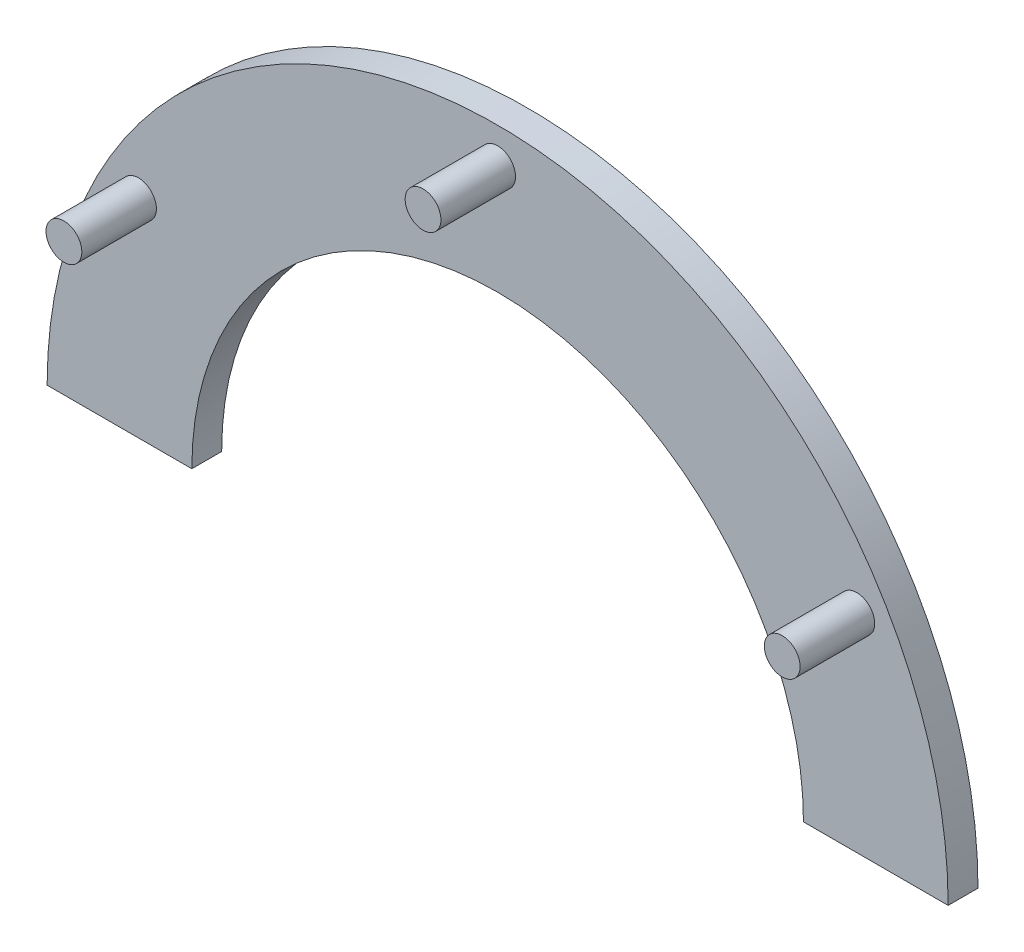
ISO-10303-21;
HEADER;
FILE_DESCRIPTION(('STEP AP214'),'2;1');
FILE_NAME('part.step','',(''),(''),'','','');
FILE_SCHEMA(('AUTOMOTIVE_DESIGN { 1 0 10303 214 1 1 1 1 }'));
ENDSEC;
DATA;
#1=APPLICATION_CONTEXT('core data for automotive mechanical design processes');
#2=APPLICATION_PROTOCOL_DEFINITION('international standard','automotive_design',2000,#1);
#3=PRODUCT_CONTEXT('',#1,'mechanical');
#4=PRODUCT('Part','Part','',(#3));
#5=PRODUCT_RELATED_PRODUCT_CATEGORY('part','',(#4));
#6=PRODUCT_DEFINITION_FORMATION('','',#4);
#7=PRODUCT_DEFINITION_CONTEXT('part definition',#1,'design');
#8=PRODUCT_DEFINITION('design','',#6,#7);
#9=PRODUCT_DEFINITION_SHAPE('','',#8);
#10=(LENGTH_UNIT() NAMED_UNIT(*) SI_UNIT(.MILLI.,.METRE.));
#11=(NAMED_UNIT(*) PLANE_ANGLE_UNIT() SI_UNIT($,.RADIAN.));
#12=(NAMED_UNIT(*) SI_UNIT($,.STERADIAN.) SOLID_ANGLE_UNIT());
#13=UNCERTAINTY_MEASURE_WITH_UNIT(LENGTH_MEASURE(1.E-05),#10,'distance_accuracy_value','');
#14=(GEOMETRIC_REPRESENTATION_CONTEXT(3) GLOBAL_UNCERTAINTY_ASSIGNED_CONTEXT((#13)) GLOBAL_UNIT_ASSIGNED_CONTEXT((#10,
#11,#12)) REPRESENTATION_CONTEXT('',''));
#15=CARTESIAN_POINT('',(0.,0.,0.));
#16=DIRECTION('',(0.,0.,1.));
#17=DIRECTION('',(1.,0.,0.));
#18=AXIS2_PLACEMENT_3D('',#15,#16,#17);
#19=CARTESIAN_POINT('',(0.,0.,2.));
#20=DIRECTION('',(0.,0.,-1.));
#21=DIRECTION('',(-1.,0.,0.));
#22=AXIS2_PLACEMENT_3D('',#19,#20,#21);
#23=CYLINDRICAL_SURFACE('',#22,20.5);
#24=CARTESIAN_POINT('',(0.,0.,0.));
#25=DIRECTION('',(0.,0.,-1.));
#26=DIRECTION('',(1.,0.,0.));
#27=AXIS2_PLACEMENT_3D('',#24,#25,#26);
#28=CIRCLE('',#27,20.5);
#29=CARTESIAN_POINT('',(-20.5,0.,0.));
#30=VERTEX_POINT('',#29);
#31=CARTESIAN_POINT('',(20.5,0.,0.));
#32=VERTEX_POINT('',#31);
#33=EDGE_CURVE('E100',#30,#32,#28,.T.);
#34=ORIENTED_EDGE('',*,*,#33,.T.);
#35=DIRECTION('',(0.,0.,-1.));
#36=VECTOR('',#35,1.);
#37=CARTESIAN_POINT('',(20.5,0.,2.));
#38=LINE('',#37,#36);
#39=CARTESIAN_POINT('',(20.5,0.,2.));
#40=VERTEX_POINT('',#39);
#41=EDGE_CURVE('E36',#40,#32,#38,.T.);
#42=ORIENTED_EDGE('',*,*,#41,.F.);
#43=CARTESIAN_POINT('',(0.,0.,2.));
#44=DIRECTION('',(0.,0.,-1.));
#45=DIRECTION('',(1.,0.,0.));
#46=AXIS2_PLACEMENT_3D('',#43,#44,#45);
#47=CIRCLE('',#46,20.5);
#48=CARTESIAN_POINT('',(-20.5,0.,2.));
#49=VERTEX_POINT('',#48);
#50=EDGE_CURVE('E87',#49,#40,#47,.T.);
#51=ORIENTED_EDGE('',*,*,#50,.F.);
#52=DIRECTION('',(0.,0.,-1.));
#53=VECTOR('',#52,1.);
#54=CARTESIAN_POINT('',(-20.5,0.,2.));
#55=LINE('',#54,#53);
#56=EDGE_CURVE('E96',#49,#30,#55,.T.);
#57=ORIENTED_EDGE('',*,*,#56,.T.);
#58=EDGE_LOOP('',(#34,#42,#51,#57));
#59=FACE_BOUND('',#58,.T.);
#60=ADVANCED_FACE('F33',(#59),#23,.F.);
#61=CARTESIAN_POINT('',(30.2,0.,2.));
#62=DIRECTION('',(0.,1.,0.));
#63=DIRECTION('',(-1.,0.,0.));
#64=AXIS2_PLACEMENT_3D('',#61,#62,#63);
#65=PLANE('',#64);
#66=DIRECTION('',(1.,0.,0.));
#67=VECTOR('',#66,1.);
#68=CARTESIAN_POINT('',(30.2,0.,0.));
#69=LINE('',#68,#67);
#70=CARTESIAN_POINT('',(30.2,0.,0.));
#71=VERTEX_POINT('',#70);
#72=EDGE_CURVE('E92',#32,#71,#69,.T.);
#73=ORIENTED_EDGE('',*,*,#72,.T.);
#74=DIRECTION('',(0.,0.,-1.));
#75=VECTOR('',#74,1.);
#76=CARTESIAN_POINT('',(30.2,0.,2.));
#77=LINE('',#76,#75);
#78=CARTESIAN_POINT('',(30.2,0.,2.));
#79=VERTEX_POINT('',#78);
#80=EDGE_CURVE('E90',#79,#71,#77,.T.);
#81=ORIENTED_EDGE('',*,*,#80,.F.);
#82=DIRECTION('',(1.,0.,0.));
#83=VECTOR('',#82,1.);
#84=CARTESIAN_POINT('',(30.2,0.,2.));
#85=LINE('',#84,#83);
#86=EDGE_CURVE('E82',#40,#79,#85,.T.);
#87=ORIENTED_EDGE('',*,*,#86,.F.);
#88=ORIENTED_EDGE('',*,*,#41,.T.);
#89=EDGE_LOOP('',(#73,#81,#87,#88));
#90=FACE_BOUND('',#89,.T.);
#91=ADVANCED_FACE('F91',(#90),#65,.F.);
#92=CARTESIAN_POINT('',(0.,0.,2.));
#93=DIRECTION('',(0.,0.,-1.));
#94=DIRECTION('',(-1.,0.,0.));
#95=AXIS2_PLACEMENT_3D('',#92,#93,#94);
#96=CYLINDRICAL_SURFACE('',#95,30.2);
#97=CARTESIAN_POINT('',(0.,0.,0.));
#98=DIRECTION('',(0.,0.,1.));
#99=DIRECTION('',(1.,0.,0.));
#100=AXIS2_PLACEMENT_3D('',#97,#98,#99);
#101=CIRCLE('',#100,30.2);
#102=CARTESIAN_POINT('',(-30.2,0.,0.));
#103=VERTEX_POINT('',#102);
#104=EDGE_CURVE('E68',#71,#103,#101,.T.);
#105=ORIENTED_EDGE('',*,*,#104,.T.);
#106=DIRECTION('',(0.,0.,-1.));
#107=VECTOR('',#106,1.);
#108=CARTESIAN_POINT('',(-30.2,0.,2.));
#109=LINE('',#108,#107);
#110=CARTESIAN_POINT('',(-30.2,0.,2.));
#111=VERTEX_POINT('',#110);
#112=EDGE_CURVE('E93',#111,#103,#109,.T.);
#113=ORIENTED_EDGE('',*,*,#112,.F.);
#114=CARTESIAN_POINT('',(0.,0.,2.));
#115=DIRECTION('',(0.,0.,1.));
#116=DIRECTION('',(1.,0.,0.));
#117=AXIS2_PLACEMENT_3D('',#114,#115,#116);
#118=CIRCLE('',#117,30.2);
#119=EDGE_CURVE('E85',#79,#111,#118,.T.);
#120=ORIENTED_EDGE('',*,*,#119,.F.);
#121=ORIENTED_EDGE('',*,*,#80,.T.);
#122=EDGE_LOOP('',(#105,#113,#120,#121));
#123=FACE_BOUND('',#122,.T.);
#124=ADVANCED_FACE('F94',(#123),#96,.T.);
#125=CARTESIAN_POINT('',(-20.5,0.,2.));
#126=DIRECTION('',(0.,1.,0.));
#127=DIRECTION('',(0.,0.,1.));
#128=AXIS2_PLACEMENT_3D('',#125,#126,#127);
#129=PLANE('',#128);
#130=DIRECTION('',(1.,0.,0.));
#131=VECTOR('',#130,1.);
#132=CARTESIAN_POINT('',(-20.5,0.,0.));
#133=LINE('',#132,#131);
#134=EDGE_CURVE('E74',#103,#30,#133,.T.);
#135=ORIENTED_EDGE('',*,*,#134,.T.);
#136=ORIENTED_EDGE('',*,*,#56,.F.);
#137=DIRECTION('',(1.,0.,0.));
#138=VECTOR('',#137,1.);
#139=CARTESIAN_POINT('',(-20.5,0.,2.));
#140=LINE('',#139,#138);
#141=EDGE_CURVE('E51',#111,#49,#140,.T.);
#142=ORIENTED_EDGE('',*,*,#141,.F.);
#143=ORIENTED_EDGE('',*,*,#112,.T.);
#144=EDGE_LOOP('',(#135,#136,#142,#143));
#145=FACE_BOUND('',#144,.T.);
#146=ADVANCED_FACE('F108',(#145),#129,.F.);
#147=CARTESIAN_POINT('',(0.,0.,2.));
#148=DIRECTION('',(0.,0.,1.));
#149=DIRECTION('',(1.,0.,0.));
#150=AXIS2_PLACEMENT_3D('',#147,#148,#149);
#151=PLANE('',#150);
#152=CARTESIAN_POINT('',(24.0755062259286,13.9000000004236,2.));
#153=DIRECTION('',(0.,0.,1.));
#154=DIRECTION('',(1.,0.,0.));
#155=AXIS2_PLACEMENT_3D('',#152,#153,#154);
#156=CIRCLE('',#155,1.2);
#157=CARTESIAN_POINT('',(25.2755062259286,13.9000000004236,2.));
#158=VERTEX_POINT('',#157);
#159=EDGE_CURVE('E11',#158,#158,#156,.T.);
#160=ORIENTED_EDGE('',*,*,#159,.F.);
#161=EDGE_LOOP('',(#160));
#162=FACE_BOUND('',#161,.T.);
#163=CARTESIAN_POINT('',(-24.0755062259323,13.9000000004171,2.));
#164=DIRECTION('',(0.,0.,1.));
#165=DIRECTION('',(1.,0.,0.));
#166=AXIS2_PLACEMENT_3D('',#163,#164,#165);
#167=CIRCLE('',#166,1.2);
#168=CARTESIAN_POINT('',(-22.8755062259323,13.9000000004171,2.));
#169=VERTEX_POINT('',#168);
#170=EDGE_CURVE('E42',#169,#169,#167,.T.);
#171=ORIENTED_EDGE('',*,*,#170,.F.);
#172=EDGE_LOOP('',(#171));
#173=FACE_BOUND('',#172,.T.);
#174=CARTESIAN_POINT('',(0.,27.8000000008363,2.));
#175=DIRECTION('',(0.,0.,1.));
#176=DIRECTION('',(1.,0.,0.));
#177=AXIS2_PLACEMENT_3D('',#174,#175,#176);
#178=CIRCLE('',#177,1.2);
#179=CARTESIAN_POINT('',(1.2,27.8000000008363,2.));
#180=VERTEX_POINT('',#179);
#181=EDGE_CURVE('E114',#180,#180,#178,.T.);
#182=ORIENTED_EDGE('',*,*,#181,.F.);
#183=EDGE_LOOP('',(#182));
#184=FACE_BOUND('',#183,.T.);
#185=ORIENTED_EDGE('',*,*,#50,.T.);
#186=ORIENTED_EDGE('',*,*,#86,.T.);
#187=ORIENTED_EDGE('',*,*,#119,.T.);
#188=ORIENTED_EDGE('',*,*,#141,.T.);
#189=EDGE_LOOP('',(#185,#186,#187,#188));
#190=FACE_BOUND('',#189,.T.);
#191=ADVANCED_FACE('F83',(#162,#173,#184,#190),#151,.T.);
#192=CARTESIAN_POINT('',(0.,0.,0.));
#193=DIRECTION('',(0.,0.,1.));
#194=DIRECTION('',(1.,0.,0.));
#195=AXIS2_PLACEMENT_3D('',#192,#193,#194);
#196=PLANE('',#195);
#197=ORIENTED_EDGE('',*,*,#33,.F.);
#198=ORIENTED_EDGE('',*,*,#134,.F.);
#199=ORIENTED_EDGE('',*,*,#104,.F.);
#200=ORIENTED_EDGE('',*,*,#72,.F.);
#201=EDGE_LOOP('',(#197,#198,#199,#200));
#202=FACE_BOUND('',#201,.T.);
#203=ADVANCED_FACE('F111',(#202),#196,.F.);
#204=CARTESIAN_POINT('',(0.,27.8000000008363,7.));
#205=DIRECTION('',(0.,0.,-1.));
#206=DIRECTION('',(-1.,0.,0.));
#207=AXIS2_PLACEMENT_3D('',#204,#205,#206);
#208=CYLINDRICAL_SURFACE('',#207,1.2);
#209=ORIENTED_EDGE('',*,*,#181,.T.);
#210=EDGE_LOOP('',(#209));
#211=FACE_BOUND('',#210,.T.);
#212=CARTESIAN_POINT('',(0.,27.8000000008363,7.));
#213=DIRECTION('',(0.,0.,-1.));
#214=DIRECTION('',(-1.,0.,0.));
#215=AXIS2_PLACEMENT_3D('',#212,#213,#214);
#216=CIRCLE('',#215,1.2);
#217=CARTESIAN_POINT('',(-1.2,27.8000000008363,7.));
#218=VERTEX_POINT('',#217);
#219=EDGE_CURVE('E103',#218,#218,#216,.T.);
#220=ORIENTED_EDGE('',*,*,#219,.T.);
#221=EDGE_LOOP('',(#220));
#222=FACE_BOUND('',#221,.T.);
#223=ADVANCED_FACE('F152',(#211,#222),#208,.T.);
#224=CARTESIAN_POINT('',(0.,27.8000000008363,7.));
#225=DIRECTION('',(0.,0.,-1.));
#226=DIRECTION('',(-1.,0.,0.));
#227=AXIS2_PLACEMENT_3D('',#224,#225,#226);
#228=PLANE('',#227);
#229=ORIENTED_EDGE('',*,*,#219,.F.);
#230=EDGE_LOOP('',(#229));
#231=FACE_BOUND('',#230,.T.);
#232=ADVANCED_FACE('F158',(#231),#228,.F.);
#233=CARTESIAN_POINT('',(-24.0755062259323,13.9000000004171,7.));
#234=DIRECTION('',(0.,0.,-1.));
#235=DIRECTION('',(-1.,0.,0.));
#236=AXIS2_PLACEMENT_3D('',#233,#234,#235);
#237=CYLINDRICAL_SURFACE('',#236,1.2);
#238=ORIENTED_EDGE('',*,*,#170,.T.);
#239=EDGE_LOOP('',(#238));
#240=FACE_BOUND('',#239,.T.);
#241=CARTESIAN_POINT('',(-24.0755062259323,13.9000000004171,7.));
#242=DIRECTION('',(0.,0.,-1.));
#243=DIRECTION('',(-1.,0.,0.));
#244=AXIS2_PLACEMENT_3D('',#241,#242,#243);
#245=CIRCLE('',#244,1.2);
#246=CARTESIAN_POINT('',(-25.2755062259323,13.9000000004171,7.));
#247=VERTEX_POINT('',#246);
#248=EDGE_CURVE('E119',#247,#247,#245,.T.);
#249=ORIENTED_EDGE('',*,*,#248,.T.);
#250=EDGE_LOOP('',(#249));
#251=FACE_BOUND('',#250,.T.);
#252=ADVANCED_FACE('F162',(#240,#251),#237,.T.);
#253=CARTESIAN_POINT('',(-24.0755062259323,13.9000000004171,7.));
#254=DIRECTION('',(0.,0.,-1.));
#255=DIRECTION('',(-1.,0.,0.));
#256=AXIS2_PLACEMENT_3D('',#253,#254,#255);
#257=PLANE('',#256);
#258=ORIENTED_EDGE('',*,*,#248,.F.);
#259=EDGE_LOOP('',(#258));
#260=FACE_BOUND('',#259,.T.);
#261=ADVANCED_FACE('F136',(#260),#257,.F.);
#262=CARTESIAN_POINT('',(24.0755062259286,13.9000000004236,7.));
#263=DIRECTION('',(0.,0.,-1.));
#264=DIRECTION('',(-1.,0.,0.));
#265=AXIS2_PLACEMENT_3D('',#262,#263,#264);
#266=CYLINDRICAL_SURFACE('',#265,1.2);
#267=ORIENTED_EDGE('',*,*,#159,.T.);
#268=EDGE_LOOP('',(#267));
#269=FACE_BOUND('',#268,.T.);
#270=CARTESIAN_POINT('',(24.0755062259286,13.9000000004236,7.));
#271=DIRECTION('',(0.,0.,-1.));
#272=DIRECTION('',(-1.,0.,0.));
#273=AXIS2_PLACEMENT_3D('',#270,#271,#272);
#274=CIRCLE('',#273,1.2);
#275=CARTESIAN_POINT('',(22.8755062259286,13.9000000004236,7.));
#276=VERTEX_POINT('',#275);
#277=EDGE_CURVE('E123',#276,#276,#274,.T.);
#278=ORIENTED_EDGE('',*,*,#277,.T.);
#279=EDGE_LOOP('',(#278));
#280=FACE_BOUND('',#279,.T.);
#281=ADVANCED_FACE('F128',(#269,#280),#266,.T.);
#282=CARTESIAN_POINT('',(24.0755062259286,13.9000000004236,7.));
#283=DIRECTION('',(0.,0.,-1.));
#284=DIRECTION('',(-1.,0.,0.));
#285=AXIS2_PLACEMENT_3D('',#282,#283,#284);
#286=PLANE('',#285);
#287=ORIENTED_EDGE('',*,*,#277,.F.);
#288=EDGE_LOOP('',(#287));
#289=FACE_BOUND('',#288,.T.);
#290=ADVANCED_FACE('F130',(#289),#286,.F.);
#291=CLOSED_SHELL('',(#60,#91,#124,#146,#191,#203,#223,#232,#252,#261,#281,#290));
#292=MANIFOLD_SOLID_BREP('B2',#291);
#293=ADVANCED_BREP_SHAPE_REPRESENTATION('',(#18,#292),#14);
#294=SHAPE_DEFINITION_REPRESENTATION(#9,#293);
ENDSEC;
END-ISO-10303-21;
